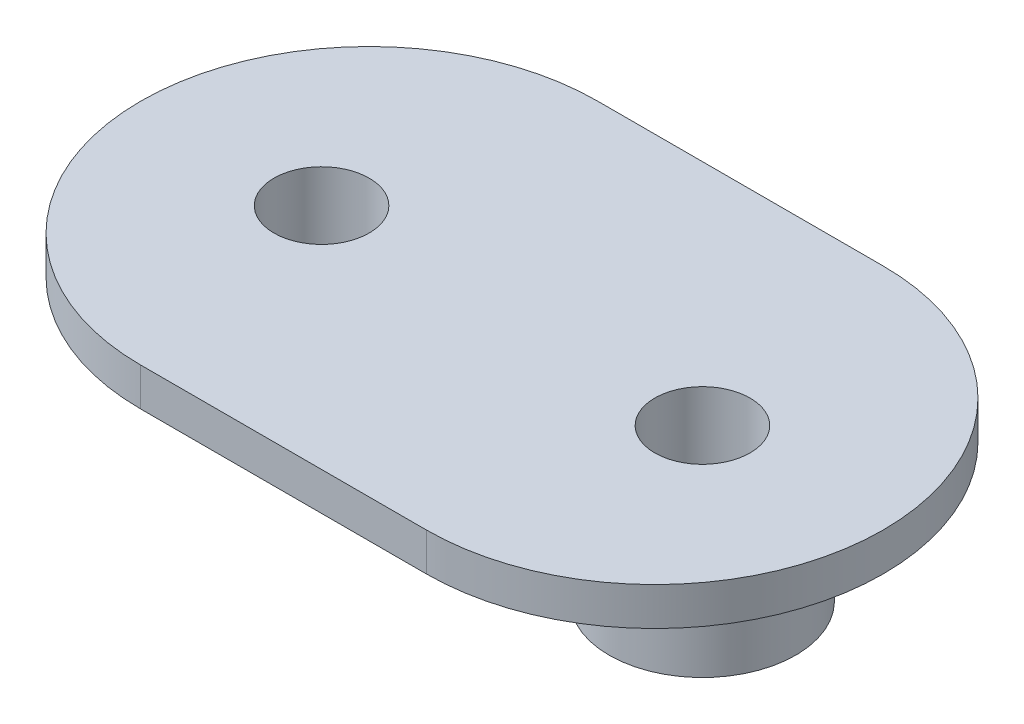
ISO-10303-21;
HEADER;
FILE_DESCRIPTION(('STEP AP214'),'2;1');
FILE_NAME('part.step','',(''),(''),'','','');
FILE_SCHEMA(('AUTOMOTIVE_DESIGN { 1 0 10303 214 1 1 1 1 }'));
ENDSEC;
DATA;
#1=APPLICATION_CONTEXT('core data for automotive mechanical design processes');
#2=APPLICATION_PROTOCOL_DEFINITION('international standard','automotive_design',2000,#1);
#3=PRODUCT_CONTEXT('',#1,'mechanical');
#4=PRODUCT('Part','Part','',(#3));
#5=PRODUCT_RELATED_PRODUCT_CATEGORY('part','',(#4));
#6=PRODUCT_DEFINITION_FORMATION('','',#4);
#7=PRODUCT_DEFINITION_CONTEXT('part definition',#1,'design');
#8=PRODUCT_DEFINITION('design','',#6,#7);
#9=PRODUCT_DEFINITION_SHAPE('','',#8);
#10=(LENGTH_UNIT() NAMED_UNIT(*) SI_UNIT(.MILLI.,.METRE.));
#11=(NAMED_UNIT(*) PLANE_ANGLE_UNIT() SI_UNIT($,.RADIAN.));
#12=(NAMED_UNIT(*) SI_UNIT($,.STERADIAN.) SOLID_ANGLE_UNIT());
#13=UNCERTAINTY_MEASURE_WITH_UNIT(LENGTH_MEASURE(1.E-05),#10,'distance_accuracy_value','');
#14=(GEOMETRIC_REPRESENTATION_CONTEXT(3) GLOBAL_UNCERTAINTY_ASSIGNED_CONTEXT((#13)) GLOBAL_UNIT_ASSIGNED_CONTEXT((#10,
#11,#12)) REPRESENTATION_CONTEXT('',''));
#15=CARTESIAN_POINT('',(0.,0.,0.));
#16=DIRECTION('',(0.,0.,1.));
#17=DIRECTION('',(1.,0.,0.));
#18=AXIS2_PLACEMENT_3D('',#15,#16,#17);
#19=CARTESIAN_POINT('',(7.5,2.,0.));
#20=DIRECTION('',(0.,-1.,0.));
#21=DIRECTION('',(0.,0.,-1.));
#22=AXIS2_PLACEMENT_3D('',#19,#20,#21);
#23=CYLINDRICAL_SURFACE('',#22,12.);
#24=CARTESIAN_POINT('',(7.5,0.,0.));
#25=DIRECTION('',(0.,1.,0.));
#26=DIRECTION('',(0.,0.,1.));
#27=AXIS2_PLACEMENT_3D('',#24,#25,#26);
#28=CIRCLE('',#27,12.);
#29=CARTESIAN_POINT('',(7.5,0.,-12.));
#30=VERTEX_POINT('',#29);
#31=CARTESIAN_POINT('',(7.5,0.,12.));
#32=VERTEX_POINT('',#31);
#33=EDGE_CURVE('E107',#30,#32,#28,.F.);
#34=ORIENTED_EDGE('',*,*,#33,.F.);
#35=DIRECTION('',(0.,-1.,0.));
#36=VECTOR('',#35,1.);
#37=CARTESIAN_POINT('',(7.5,2.,-12.));
#38=LINE('',#37,#36);
#39=CARTESIAN_POINT('',(7.5,2.,-12.));
#40=VERTEX_POINT('',#39);
#41=EDGE_CURVE('E45',#40,#30,#38,.T.);
#42=ORIENTED_EDGE('',*,*,#41,.F.);
#43=CARTESIAN_POINT('',(7.5,2.,0.));
#44=DIRECTION('',(0.,1.,0.));
#45=DIRECTION('',(0.,0.,1.));
#46=AXIS2_PLACEMENT_3D('',#43,#44,#45);
#47=CIRCLE('',#46,12.);
#48=CARTESIAN_POINT('',(7.5,2.,12.));
#49=VERTEX_POINT('',#48);
#50=EDGE_CURVE('E101',#40,#49,#47,.F.);
#51=ORIENTED_EDGE('',*,*,#50,.T.);
#52=DIRECTION('',(0.,-1.,0.));
#53=VECTOR('',#52,1.);
#54=CARTESIAN_POINT('',(7.5,2.,12.));
#55=LINE('',#54,#53);
#56=EDGE_CURVE('E77',#49,#32,#55,.T.);
#57=ORIENTED_EDGE('',*,*,#56,.T.);
#58=EDGE_LOOP('',(#34,#42,#51,#57));
#59=FACE_BOUND('',#58,.T.);
#60=ADVANCED_FACE('F37',(#59),#23,.T.);
#61=CARTESIAN_POINT('',(0.,2.,-12.));
#62=DIRECTION('',(0.,0.,-1.));
#63=DIRECTION('',(-1.,0.,0.));
#64=AXIS2_PLACEMENT_3D('',#61,#62,#63);
#65=PLANE('',#64);
#66=DIRECTION('',(1.,0.,0.));
#67=VECTOR('',#66,1.);
#68=CARTESIAN_POINT('',(0.,0.,-12.));
#69=LINE('',#68,#67);
#70=CARTESIAN_POINT('',(-7.5,0.,-12.));
#71=VERTEX_POINT('',#70);
#72=EDGE_CURVE('E90',#71,#30,#69,.T.);
#73=ORIENTED_EDGE('',*,*,#72,.F.);
#74=DIRECTION('',(0.,-1.,0.));
#75=VECTOR('',#74,1.);
#76=CARTESIAN_POINT('',(-7.5,2.,-12.));
#77=LINE('',#76,#75);
#78=CARTESIAN_POINT('',(-7.5,2.,-12.));
#79=VERTEX_POINT('',#78);
#80=EDGE_CURVE('E84',#79,#71,#77,.T.);
#81=ORIENTED_EDGE('',*,*,#80,.F.);
#82=DIRECTION('',(1.,0.,0.));
#83=VECTOR('',#82,1.);
#84=CARTESIAN_POINT('',(0.,2.,-12.));
#85=LINE('',#84,#83);
#86=EDGE_CURVE('E88',#79,#40,#85,.T.);
#87=ORIENTED_EDGE('',*,*,#86,.T.);
#88=ORIENTED_EDGE('',*,*,#41,.T.);
#89=EDGE_LOOP('',(#73,#81,#87,#88));
#90=FACE_BOUND('',#89,.T.);
#91=ADVANCED_FACE('F86',(#90),#65,.T.);
#92=CARTESIAN_POINT('',(-7.5,2.,0.));
#93=DIRECTION('',(0.,-1.,0.));
#94=DIRECTION('',(0.,0.,-1.));
#95=AXIS2_PLACEMENT_3D('',#92,#93,#94);
#96=CYLINDRICAL_SURFACE('',#95,12.);
#97=CARTESIAN_POINT('',(-7.5,0.,0.));
#98=DIRECTION('',(0.,1.,0.));
#99=DIRECTION('',(0.,0.,1.));
#100=AXIS2_PLACEMENT_3D('',#97,#98,#99);
#101=CIRCLE('',#100,12.);
#102=CARTESIAN_POINT('',(-7.5,0.,12.));
#103=VERTEX_POINT('',#102);
#104=EDGE_CURVE('E111',#71,#103,#101,.T.);
#105=ORIENTED_EDGE('',*,*,#104,.T.);
#106=DIRECTION('',(0.,-1.,0.));
#107=VECTOR('',#106,1.);
#108=CARTESIAN_POINT('',(-7.5,2.,12.));
#109=LINE('',#108,#107);
#110=CARTESIAN_POINT('',(-7.5,2.,12.));
#111=VERTEX_POINT('',#110);
#112=EDGE_CURVE('E93',#111,#103,#109,.T.);
#113=ORIENTED_EDGE('',*,*,#112,.F.);
#114=CARTESIAN_POINT('',(-7.5,2.,0.));
#115=DIRECTION('',(0.,1.,0.));
#116=DIRECTION('',(0.,0.,1.));
#117=AXIS2_PLACEMENT_3D('',#114,#115,#116);
#118=CIRCLE('',#117,12.);
#119=EDGE_CURVE('E96',#79,#111,#118,.T.);
#120=ORIENTED_EDGE('',*,*,#119,.F.);
#121=ORIENTED_EDGE('',*,*,#80,.T.);
#122=EDGE_LOOP('',(#105,#113,#120,#121));
#123=FACE_BOUND('',#122,.T.);
#124=ADVANCED_FACE('F97',(#123),#96,.T.);
#125=CARTESIAN_POINT('',(0.,2.,12.));
#126=DIRECTION('',(0.,0.,-1.));
#127=DIRECTION('',(-1.,0.,0.));
#128=AXIS2_PLACEMENT_3D('',#125,#126,#127);
#129=PLANE('',#128);
#130=DIRECTION('',(1.,0.,0.));
#131=VECTOR('',#130,1.);
#132=CARTESIAN_POINT('',(0.,0.,12.));
#133=LINE('',#132,#131);
#134=EDGE_CURVE('E70',#103,#32,#133,.T.);
#135=ORIENTED_EDGE('',*,*,#134,.T.);
#136=ORIENTED_EDGE('',*,*,#56,.F.);
#137=DIRECTION('',(1.,0.,0.));
#138=VECTOR('',#137,1.);
#139=CARTESIAN_POINT('',(0.,2.,12.));
#140=LINE('',#139,#138);
#141=EDGE_CURVE('E53',#111,#49,#140,.T.);
#142=ORIENTED_EDGE('',*,*,#141,.F.);
#143=ORIENTED_EDGE('',*,*,#112,.T.);
#144=EDGE_LOOP('',(#135,#136,#142,#143));
#145=FACE_BOUND('',#144,.T.);
#146=ADVANCED_FACE('F169',(#145),#129,.F.);
#147=CARTESIAN_POINT('',(0.,2.,0.));
#148=DIRECTION('',(0.,1.,0.));
#149=DIRECTION('',(0.,0.,1.));
#150=AXIS2_PLACEMENT_3D('',#147,#148,#149);
#151=PLANE('',#150);
#152=ORIENTED_EDGE('',*,*,#50,.F.);
#153=ORIENTED_EDGE('',*,*,#86,.F.);
#154=ORIENTED_EDGE('',*,*,#119,.T.);
#155=ORIENTED_EDGE('',*,*,#141,.T.);
#156=EDGE_LOOP('',(#152,#153,#154,#155));
#157=FACE_BOUND('',#156,.T.);
#158=CARTESIAN_POINT('',(-10.,2.,0.));
#159=DIRECTION('',(0.,1.,0.));
#160=DIRECTION('',(0.,0.,1.));
#161=AXIS2_PLACEMENT_3D('',#158,#159,#160);
#162=CIRCLE('',#161,2.5);
#163=CARTESIAN_POINT('',(-10.,2.,2.5));
#164=VERTEX_POINT('',#163);
#165=EDGE_CURVE('E134',#164,#164,#162,.T.);
#166=ORIENTED_EDGE('',*,*,#165,.F.);
#167=EDGE_LOOP('',(#166));
#168=FACE_BOUND('',#167,.T.);
#169=CARTESIAN_POINT('',(10.,2.,0.));
#170=DIRECTION('',(0.,1.,0.));
#171=DIRECTION('',(0.,0.,1.));
#172=AXIS2_PLACEMENT_3D('',#169,#170,#171);
#173=CIRCLE('',#172,2.5);
#174=CARTESIAN_POINT('',(10.,2.,2.5));
#175=VERTEX_POINT('',#174);
#176=EDGE_CURVE('E124',#175,#175,#173,.T.);
#177=ORIENTED_EDGE('',*,*,#176,.F.);
#178=EDGE_LOOP('',(#177));
#179=FACE_BOUND('',#178,.T.);
#180=ADVANCED_FACE('F99',(#157,#168,#179),#151,.T.);
#181=CARTESIAN_POINT('',(0.,0.,0.));
#182=DIRECTION('',(0.,1.,0.));
#183=DIRECTION('',(0.,0.,1.));
#184=AXIS2_PLACEMENT_3D('',#181,#182,#183);
#185=PLANE('',#184);
#186=CARTESIAN_POINT('',(-10.,0.,0.));
#187=DIRECTION('',(0.,1.,0.));
#188=DIRECTION('',(0.,0.,1.));
#189=AXIS2_PLACEMENT_3D('',#186,#187,#188);
#190=CIRCLE('',#189,4.9);
#191=CARTESIAN_POINT('',(-10.,0.,4.9));
#192=VERTEX_POINT('',#191);
#193=EDGE_CURVE('E11',#192,#192,#190,.F.);
#194=ORIENTED_EDGE('',*,*,#193,.F.);
#195=EDGE_LOOP('',(#194));
#196=FACE_BOUND('',#195,.T.);
#197=ORIENTED_EDGE('',*,*,#33,.T.);
#198=ORIENTED_EDGE('',*,*,#134,.F.);
#199=ORIENTED_EDGE('',*,*,#104,.F.);
#200=ORIENTED_EDGE('',*,*,#72,.T.);
#201=EDGE_LOOP('',(#197,#198,#199,#200));
#202=FACE_BOUND('',#201,.T.);
#203=CARTESIAN_POINT('',(10.,0.,0.));
#204=DIRECTION('',(0.,1.,0.));
#205=DIRECTION('',(0.,0.,1.));
#206=AXIS2_PLACEMENT_3D('',#203,#204,#205);
#207=CIRCLE('',#206,4.9);
#208=CARTESIAN_POINT('',(10.,0.,4.9));
#209=VERTEX_POINT('',#208);
#210=EDGE_CURVE('E109',#209,#209,#207,.F.);
#211=ORIENTED_EDGE('',*,*,#210,.F.);
#212=EDGE_LOOP('',(#211));
#213=FACE_BOUND('',#212,.T.);
#214=ADVANCED_FACE('F115',(#196,#202,#213),#185,.F.);
#215=CARTESIAN_POINT('',(10.,2.,0.));
#216=DIRECTION('',(0.,-1.,0.));
#217=DIRECTION('',(0.,0.,-1.));
#218=AXIS2_PLACEMENT_3D('',#215,#216,#217);
#219=CYLINDRICAL_SURFACE('',#218,4.9);
#220=CARTESIAN_POINT('',(10.,-6.,0.));
#221=DIRECTION('',(0.,1.,0.));
#222=DIRECTION('',(0.,0.,1.));
#223=AXIS2_PLACEMENT_3D('',#220,#221,#222);
#224=CIRCLE('',#223,4.9);
#225=CARTESIAN_POINT('',(10.,-6.,4.9));
#226=VERTEX_POINT('',#225);
#227=EDGE_CURVE('E126',#226,#226,#224,.T.);
#228=ORIENTED_EDGE('',*,*,#227,.T.);
#229=EDGE_LOOP('',(#228));
#230=FACE_BOUND('',#229,.T.);
#231=ORIENTED_EDGE('',*,*,#210,.T.);
#232=EDGE_LOOP('',(#231));
#233=FACE_BOUND('',#232,.T.);
#234=ADVANCED_FACE('F118',(#230,#233),#219,.T.);
#235=CARTESIAN_POINT('',(10.,2.,0.));
#236=DIRECTION('',(0.,-1.,0.));
#237=DIRECTION('',(0.,0.,-1.));
#238=AXIS2_PLACEMENT_3D('',#235,#236,#237);
#239=CYLINDRICAL_SURFACE('',#238,2.5);
#240=ORIENTED_EDGE('',*,*,#176,.T.);
#241=EDGE_LOOP('',(#240));
#242=FACE_BOUND('',#241,.T.);
#243=CARTESIAN_POINT('',(10.,-6.,0.));
#244=DIRECTION('',(0.,1.,0.));
#245=DIRECTION('',(0.,0.,1.));
#246=AXIS2_PLACEMENT_3D('',#243,#244,#245);
#247=CIRCLE('',#246,2.5);
#248=CARTESIAN_POINT('',(10.,-6.,2.5));
#249=VERTEX_POINT('',#248);
#250=EDGE_CURVE('E131',#249,#249,#247,.T.);
#251=ORIENTED_EDGE('',*,*,#250,.F.);
#252=EDGE_LOOP('',(#251));
#253=FACE_BOUND('',#252,.T.);
#254=ADVANCED_FACE('F177',(#242,#253),#239,.F.);
#255=CARTESIAN_POINT('',(0.,-6.,0.));
#256=DIRECTION('',(0.,1.,0.));
#257=DIRECTION('',(0.,0.,1.));
#258=AXIS2_PLACEMENT_3D('',#255,#256,#257);
#259=PLANE('',#258);
#260=ORIENTED_EDGE('',*,*,#250,.T.);
#261=EDGE_LOOP('',(#260));
#262=FACE_BOUND('',#261,.T.);
#263=ORIENTED_EDGE('',*,*,#227,.F.);
#264=EDGE_LOOP('',(#263));
#265=FACE_BOUND('',#264,.T.);
#266=ADVANCED_FACE('F160',(#262,#265),#259,.F.);
#267=CARTESIAN_POINT('',(-10.,2.,0.));
#268=DIRECTION('',(0.,-1.,0.));
#269=DIRECTION('',(0.,0.,-1.));
#270=AXIS2_PLACEMENT_3D('',#267,#268,#269);
#271=CYLINDRICAL_SURFACE('',#270,4.9);
#272=CARTESIAN_POINT('',(-10.,-6.,0.));
#273=DIRECTION('',(0.,1.,0.));
#274=DIRECTION('',(0.,0.,1.));
#275=AXIS2_PLACEMENT_3D('',#272,#273,#274);
#276=CIRCLE('',#275,4.9);
#277=CARTESIAN_POINT('',(-10.,-6.,4.9));
#278=VERTEX_POINT('',#277);
#279=EDGE_CURVE('E140',#278,#278,#276,.T.);
#280=ORIENTED_EDGE('',*,*,#279,.T.);
#281=EDGE_LOOP('',(#280));
#282=FACE_BOUND('',#281,.T.);
#283=ORIENTED_EDGE('',*,*,#193,.T.);
#284=EDGE_LOOP('',(#283));
#285=FACE_BOUND('',#284,.T.);
#286=ADVANCED_FACE('F144',(#282,#285),#271,.T.);
#287=CARTESIAN_POINT('',(-10.,2.,0.));
#288=DIRECTION('',(0.,-1.,0.));
#289=DIRECTION('',(0.,0.,-1.));
#290=AXIS2_PLACEMENT_3D('',#287,#288,#289);
#291=CYLINDRICAL_SURFACE('',#290,2.5);
#292=ORIENTED_EDGE('',*,*,#165,.T.);
#293=EDGE_LOOP('',(#292));
#294=FACE_BOUND('',#293,.T.);
#295=CARTESIAN_POINT('',(-10.,-6.,0.));
#296=DIRECTION('',(0.,1.,0.));
#297=DIRECTION('',(0.,0.,1.));
#298=AXIS2_PLACEMENT_3D('',#295,#296,#297);
#299=CIRCLE('',#298,2.5);
#300=CARTESIAN_POINT('',(-10.,-6.,2.5));
#301=VERTEX_POINT('',#300);
#302=EDGE_CURVE('E137',#301,#301,#299,.T.);
#303=ORIENTED_EDGE('',*,*,#302,.F.);
#304=EDGE_LOOP('',(#303));
#305=FACE_BOUND('',#304,.T.);
#306=ADVANCED_FACE('F150',(#294,#305),#291,.F.);
#307=CARTESIAN_POINT('',(0.,-6.,0.));
#308=DIRECTION('',(0.,1.,0.));
#309=DIRECTION('',(0.,0.,1.));
#310=AXIS2_PLACEMENT_3D('',#307,#308,#309);
#311=PLANE('',#310);
#312=ORIENTED_EDGE('',*,*,#279,.F.);
#313=EDGE_LOOP('',(#312));
#314=FACE_BOUND('',#313,.T.);
#315=ORIENTED_EDGE('',*,*,#302,.T.);
#316=EDGE_LOOP('',(#315));
#317=FACE_BOUND('',#316,.T.);
#318=ADVANCED_FACE('F147',(#314,#317),#311,.F.);
#319=CLOSED_SHELL('',(#60,#91,#124,#146,#180,#214,#234,#254,#266,#286,#306,#318));
#320=MANIFOLD_SOLID_BREP('B2',#319);
#321=ADVANCED_BREP_SHAPE_REPRESENTATION('',(#18,#320),#14);
#322=SHAPE_DEFINITION_REPRESENTATION(#9,#321);
ENDSEC;
END-ISO-10303-21;
